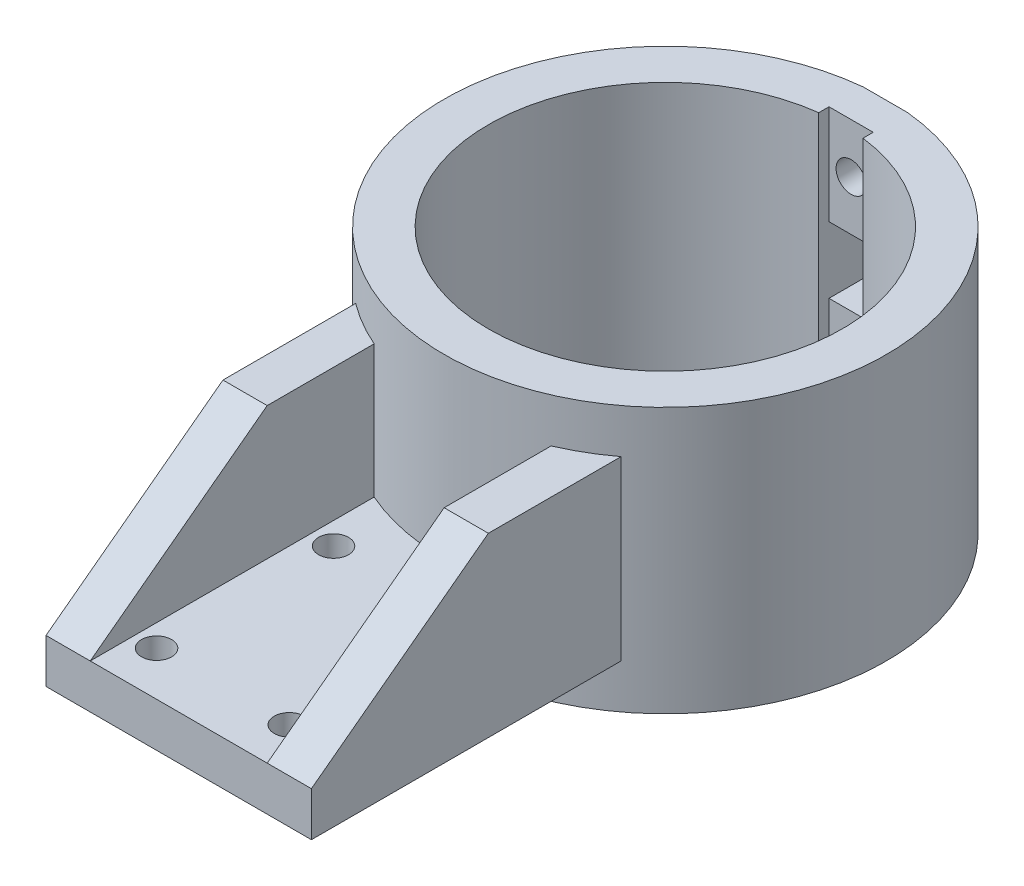
ISO-10303-21;
HEADER;
FILE_DESCRIPTION(('STEP AP214'),'2;1');
FILE_NAME('part.step','',(''),(''),'','','');
FILE_SCHEMA(('AUTOMOTIVE_DESIGN { 1 0 10303 214 1 1 1 1 }'));
ENDSEC;
DATA;
#1=APPLICATION_CONTEXT('core data for automotive mechanical design processes');
#2=APPLICATION_PROTOCOL_DEFINITION('international standard','automotive_design',2000,#1);
#3=PRODUCT_CONTEXT('',#1,'mechanical');
#4=PRODUCT('Part','Part','',(#3));
#5=PRODUCT_RELATED_PRODUCT_CATEGORY('part','',(#4));
#6=PRODUCT_DEFINITION_FORMATION('','',#4);
#7=PRODUCT_DEFINITION_CONTEXT('part definition',#1,'design');
#8=PRODUCT_DEFINITION('design','',#6,#7);
#9=PRODUCT_DEFINITION_SHAPE('','',#8);
#10=(LENGTH_UNIT() NAMED_UNIT(*) SI_UNIT(.MILLI.,.METRE.));
#11=(NAMED_UNIT(*) PLANE_ANGLE_UNIT() SI_UNIT($,.RADIAN.));
#12=(NAMED_UNIT(*) SI_UNIT($,.STERADIAN.) SOLID_ANGLE_UNIT());
#13=UNCERTAINTY_MEASURE_WITH_UNIT(LENGTH_MEASURE(1.E-05),#10,'distance_accuracy_value','');
#14=(GEOMETRIC_REPRESENTATION_CONTEXT(3) GLOBAL_UNCERTAINTY_ASSIGNED_CONTEXT((#13)) GLOBAL_UNIT_ASSIGNED_CONTEXT((#10,
#11,#12)) REPRESENTATION_CONTEXT('',''));
#15=CARTESIAN_POINT('',(0.,0.,0.));
#16=DIRECTION('',(0.,0.,1.));
#17=DIRECTION('',(1.,0.,0.));
#18=AXIS2_PLACEMENT_3D('',#15,#16,#17);
#19=CARTESIAN_POINT('',(-5.,0.,-42.));
#20=DIRECTION('',(0.,0.,-1.));
#21=DIRECTION('',(-1.,0.,0.));
#22=AXIS2_PLACEMENT_3D('',#19,#20,#21);
#23=PLANE('',#22);
#24=CARTESIAN_POINT('',(0.,11.25,-42.));
#25=DIRECTION('',(0.,0.,-1.));
#26=DIRECTION('',(-1.,0.,0.));
#27=AXIS2_PLACEMENT_3D('',#24,#25,#26);
#28=CIRCLE('',#27,3.39999999999999);
#29=CARTESIAN_POINT('',(-3.39999999999999,11.25,-42.));
#30=VERTEX_POINT('',#29);
#31=EDGE_CURVE('E326',#30,#30,#28,.T.);
#32=ORIENTED_EDGE('',*,*,#31,.T.);
#33=EDGE_LOOP('',(#32));
#34=FACE_BOUND('',#33,.T.);
#35=DIRECTION('',(0.,1.,0.));
#36=VECTOR('',#35,1.);
#37=CARTESIAN_POINT('',(5.,0.,-42.));
#38=LINE('',#37,#36);
#39=CARTESIAN_POINT('',(5.,0.,-42.));
#40=VERTEX_POINT('',#39);
#41=CARTESIAN_POINT('',(5.,22.5,-42.));
#42=VERTEX_POINT('',#41);
#43=EDGE_CURVE('E356',#40,#42,#38,.T.);
#44=ORIENTED_EDGE('',*,*,#43,.T.);
#45=DIRECTION('',(1.,0.,0.));
#46=VECTOR('',#45,1.);
#47=CARTESIAN_POINT('',(5.,22.5,-42.));
#48=LINE('',#47,#46);
#49=CARTESIAN_POINT('',(-5.,22.5,-42.));
#50=VERTEX_POINT('',#49);
#51=EDGE_CURVE('E55',#50,#42,#48,.T.);
#52=ORIENTED_EDGE('',*,*,#51,.F.);
#53=DIRECTION('',(0.,1.,0.));
#54=VECTOR('',#53,1.);
#55=CARTESIAN_POINT('',(-5.,0.,-42.));
#56=LINE('',#55,#54);
#57=CARTESIAN_POINT('',(-5.,0.,-42.));
#58=VERTEX_POINT('',#57);
#59=EDGE_CURVE('E216',#58,#50,#56,.T.);
#60=ORIENTED_EDGE('',*,*,#59,.F.);
#61=DIRECTION('',(-1.,0.,0.));
#62=VECTOR('',#61,1.);
#63=CARTESIAN_POINT('',(-5.,0.,-42.));
#64=LINE('',#63,#62);
#65=EDGE_CURVE('E342',#40,#58,#64,.T.);
#66=ORIENTED_EDGE('',*,*,#65,.F.);
#67=EDGE_LOOP('',(#44,#52,#60,#66));
#68=FACE_BOUND('',#67,.T.);
#69=ADVANCED_FACE('F38',(#34,#68),#23,.F.);
#70=CARTESIAN_POINT('',(5.,0.,-49.749371855331));
#71=DIRECTION('',(0.,0.,1.));
#72=DIRECTION('',(1.,0.,0.));
#73=AXIS2_PLACEMENT_3D('',#70,#71,#72);
#74=PLANE('',#73);
#75=CARTESIAN_POINT('',(0.,11.25,-49.749371855331));
#76=DIRECTION('',(0.,0.,-1.));
#77=DIRECTION('',(-1.,0.,0.));
#78=AXIS2_PLACEMENT_3D('',#75,#76,#77);
#79=CIRCLE('',#78,3.39999999999999);
#80=CARTESIAN_POINT('',(-3.4,11.25,-49.749371855331));
#81=VERTEX_POINT('',#80);
#82=EDGE_CURVE('E299',#81,#81,#79,.T.);
#83=ORIENTED_EDGE('',*,*,#82,.F.);
#84=EDGE_LOOP('',(#83));
#85=FACE_BOUND('',#84,.T.);
#86=DIRECTION('',(0.,1.,0.));
#87=VECTOR('',#86,1.);
#88=CARTESIAN_POINT('',(-5.,0.,-49.749371855331));
#89=LINE('',#88,#87);
#90=CARTESIAN_POINT('',(-5.,0.,-49.749371855331));
#91=VERTEX_POINT('',#90);
#92=CARTESIAN_POINT('',(-5.,22.5,-49.749371855331));
#93=VERTEX_POINT('',#92);
#94=EDGE_CURVE('E194',#91,#93,#89,.T.);
#95=ORIENTED_EDGE('',*,*,#94,.T.);
#96=DIRECTION('',(-1.,0.,0.));
#97=VECTOR('',#96,1.);
#98=CARTESIAN_POINT('',(5.,22.5,-49.749371855331));
#99=LINE('',#98,#97);
#100=CARTESIAN_POINT('',(5.,22.5,-49.749371855331));
#101=VERTEX_POINT('',#100);
#102=EDGE_CURVE('E172',#101,#93,#99,.T.);
#103=ORIENTED_EDGE('',*,*,#102,.F.);
#104=DIRECTION('',(0.,1.,0.));
#105=VECTOR('',#104,1.);
#106=CARTESIAN_POINT('',(5.,0.,-49.749371855331));
#107=LINE('',#106,#105);
#108=CARTESIAN_POINT('',(5.,0.,-49.749371855331));
#109=VERTEX_POINT('',#108);
#110=EDGE_CURVE('E191',#109,#101,#107,.T.);
#111=ORIENTED_EDGE('',*,*,#110,.F.);
#112=DIRECTION('',(1.,0.,0.));
#113=VECTOR('',#112,1.);
#114=CARTESIAN_POINT('',(5.,0.,-49.749371855331));
#115=LINE('',#114,#113);
#116=EDGE_CURVE('E357',#91,#109,#115,.T.);
#117=ORIENTED_EDGE('',*,*,#116,.F.);
#118=EDGE_LOOP('',(#95,#103,#111,#117));
#119=FACE_BOUND('',#118,.T.);
#120=ADVANCED_FACE('F190',(#85,#119),#74,.F.);
#121=CARTESIAN_POINT('',(0.,60.,0.));
#122=DIRECTION('',(0.,1.,0.));
#123=DIRECTION('',(0.,0.,1.));
#124=AXIS2_PLACEMENT_3D('',#121,#122,#123);
#125=PLANE('',#124);
#126=DIRECTION('',(0.,0.,-1.));
#127=VECTOR('',#126,1.);
#128=CARTESIAN_POINT('',(5.,60.,-42.));
#129=LINE('',#128,#127);
#130=CARTESIAN_POINT('',(5.,60.,-39.6862696659689));
#131=VERTEX_POINT('',#130);
#132=CARTESIAN_POINT('',(5.,60.,-42.));
#133=VERTEX_POINT('',#132);
#134=EDGE_CURVE('E201',#131,#133,#129,.T.);
#135=ORIENTED_EDGE('',*,*,#134,.F.);
#136=CARTESIAN_POINT('',(0.,60.,0.));
#137=DIRECTION('',(0.,1.,0.));
#138=DIRECTION('',(0.,0.,1.));
#139=AXIS2_PLACEMENT_3D('',#136,#137,#138);
#140=CIRCLE('',#139,40.);
#141=CARTESIAN_POINT('',(-5.,60.,-39.6862696659689));
#142=VERTEX_POINT('',#141);
#143=EDGE_CURVE('E283',#142,#131,#140,.T.);
#144=ORIENTED_EDGE('',*,*,#143,.F.);
#145=DIRECTION('',(0.,0.,1.));
#146=VECTOR('',#145,1.);
#147=CARTESIAN_POINT('',(-5.,60.,-42.));
#148=LINE('',#147,#146);
#149=CARTESIAN_POINT('',(-5.,60.,-42.));
#150=VERTEX_POINT('',#149);
#151=EDGE_CURVE('E343',#150,#142,#148,.T.);
#152=ORIENTED_EDGE('',*,*,#151,.F.);
#153=DIRECTION('',(-1.,0.,0.));
#154=VECTOR('',#153,1.);
#155=CARTESIAN_POINT('',(-5.,60.,-42.));
#156=LINE('',#155,#154);
#157=EDGE_CURVE('E205',#133,#150,#156,.T.);
#158=ORIENTED_EDGE('',*,*,#157,.F.);
#159=EDGE_LOOP('',(#135,#144,#152,#158));
#160=FACE_BOUND('',#159,.T.);
#161=DIRECTION('',(1.,0.,0.));
#162=VECTOR('',#161,1.);
#163=CARTESIAN_POINT('',(5.,60.,-49.749371855331));
#164=LINE('',#163,#162);
#165=CARTESIAN_POINT('',(-5.,60.,-49.749371855331));
#166=VERTEX_POINT('',#165);
#167=CARTESIAN_POINT('',(5.,60.,-49.749371855331));
#168=VERTEX_POINT('',#167);
#169=EDGE_CURVE('E209',#166,#168,#164,.T.);
#170=ORIENTED_EDGE('',*,*,#169,.F.);
#171=CARTESIAN_POINT('',(0.,60.,0.));
#172=DIRECTION('',(0.,1.,0.));
#173=DIRECTION('',(0.,0.,1.));
#174=AXIS2_PLACEMENT_3D('',#171,#172,#173);
#175=CIRCLE('',#174,50.);
#176=EDGE_CURVE('E288',#166,#168,#175,.T.);
#177=ORIENTED_EDGE('',*,*,#176,.T.);
#178=EDGE_LOOP('',(#170,#177));
#179=FACE_BOUND('',#178,.T.);
#180=ADVANCED_FACE('F365',(#160,#179),#125,.T.);
#181=CARTESIAN_POINT('',(0.,0.,0.));
#182=DIRECTION('',(0.,1.,0.));
#183=DIRECTION('',(0.,0.,1.));
#184=AXIS2_PLACEMENT_3D('',#181,#182,#183);
#185=PLANE('',#184);
#186=CARTESIAN_POINT('',(0.,0.,0.));
#187=DIRECTION('',(0.,1.,0.));
#188=DIRECTION('',(0.,0.,1.));
#189=AXIS2_PLACEMENT_3D('',#186,#187,#188);
#190=CIRCLE('',#189,40.);
#191=CARTESIAN_POINT('',(-5.,0.,-39.6862696659689));
#192=VERTEX_POINT('',#191);
#193=CARTESIAN_POINT('',(5.,0.,-39.6862696659689));
#194=VERTEX_POINT('',#193);
#195=EDGE_CURVE('E269',#192,#194,#190,.T.);
#196=ORIENTED_EDGE('',*,*,#195,.T.);
#197=DIRECTION('',(0.,0.,-1.));
#198=VECTOR('',#197,1.);
#199=CARTESIAN_POINT('',(5.,0.,-42.));
#200=LINE('',#199,#198);
#201=EDGE_CURVE('E339',#194,#40,#200,.T.);
#202=ORIENTED_EDGE('',*,*,#201,.T.);
#203=ORIENTED_EDGE('',*,*,#65,.T.);
#204=DIRECTION('',(0.,0.,1.));
#205=VECTOR('',#204,1.);
#206=CARTESIAN_POINT('',(-5.,0.,-42.));
#207=LINE('',#206,#205);
#208=EDGE_CURVE('E346',#58,#192,#207,.T.);
#209=ORIENTED_EDGE('',*,*,#208,.T.);
#210=EDGE_LOOP('',(#196,#202,#203,#209));
#211=FACE_BOUND('',#210,.T.);
#212=CARTESIAN_POINT('',(0.,0.,0.));
#213=DIRECTION('',(0.,1.,0.));
#214=DIRECTION('',(0.,0.,1.));
#215=AXIS2_PLACEMENT_3D('',#212,#213,#214);
#216=CIRCLE('',#215,50.);
#217=EDGE_CURVE('E200',#91,#109,#216,.T.);
#218=ORIENTED_EDGE('',*,*,#217,.F.);
#219=ORIENTED_EDGE('',*,*,#116,.T.);
#220=EDGE_LOOP('',(#218,#219));
#221=FACE_BOUND('',#220,.T.);
#222=ADVANCED_FACE('F379',(#211,#221),#185,.F.);
#223=CARTESIAN_POINT('',(0.,60.,0.));
#224=DIRECTION('',(0.,-1.,0.));
#225=DIRECTION('',(0.,0.,-1.));
#226=AXIS2_PLACEMENT_3D('',#223,#224,#225);
#227=CYLINDRICAL_SURFACE('',#226,50.);
#228=DIRECTION('',(0.,-1.,0.));
#229=VECTOR('',#228,1.);
#230=CARTESIAN_POINT('',(-20.,60.,45.8257569495584));
#231=LINE('',#230,#229);
#232=CARTESIAN_POINT('',(-20.,20.,45.8257569495584));
#233=VERTEX_POINT('',#232);
#234=CARTESIAN_POINT('',(-20.,50.,45.8257569495584));
#235=VERTEX_POINT('',#234);
#236=EDGE_CURVE('E237',#233,#235,#231,.F.);
#237=ORIENTED_EDGE('',*,*,#236,.F.);
#238=CARTESIAN_POINT('',(0.,20.,0.));
#239=DIRECTION('',(0.,1.,0.));
#240=DIRECTION('',(0.,0.,1.));
#241=AXIS2_PLACEMENT_3D('',#238,#239,#240);
#242=CIRCLE('',#241,50.);
#243=CARTESIAN_POINT('',(20.,20.,45.8257569495584));
#244=VERTEX_POINT('',#243);
#245=EDGE_CURVE('E265',#244,#233,#242,.F.);
#246=ORIENTED_EDGE('',*,*,#245,.F.);
#247=DIRECTION('',(0.,-1.,0.));
#248=VECTOR('',#247,1.);
#249=CARTESIAN_POINT('',(20.,60.,45.8257569495584));
#250=LINE('',#249,#248);
#251=CARTESIAN_POINT('',(20.,50.,45.8257569495584));
#252=VERTEX_POINT('',#251);
#253=EDGE_CURVE('E262',#252,#244,#250,.T.);
#254=ORIENTED_EDGE('',*,*,#253,.F.);
#255=CARTESIAN_POINT('',(0.,50.,0.));
#256=DIRECTION('',(0.,1.,0.));
#257=DIRECTION('',(-1.,0.,0.));
#258=AXIS2_PLACEMENT_3D('',#255,#256,#257);
#259=CIRCLE('',#258,50.);
#260=CARTESIAN_POINT('',(30.,50.,40.));
#261=VERTEX_POINT('',#260);
#262=EDGE_CURVE('E261',#261,#252,#259,.F.);
#263=ORIENTED_EDGE('',*,*,#262,.F.);
#264=DIRECTION('',(0.,-1.,0.));
#265=VECTOR('',#264,1.);
#266=CARTESIAN_POINT('',(30.,60.,40.));
#267=LINE('',#266,#265);
#268=CARTESIAN_POINT('',(30.,10.,40.));
#269=VERTEX_POINT('',#268);
#270=EDGE_CURVE('E258',#269,#261,#267,.F.);
#271=ORIENTED_EDGE('',*,*,#270,.F.);
#272=CARTESIAN_POINT('',(0.,10.,0.));
#273=DIRECTION('',(0.,-1.,0.));
#274=DIRECTION('',(1.,0.,0.));
#275=AXIS2_PLACEMENT_3D('',#272,#273,#274);
#276=CIRCLE('',#275,50.);
#277=CARTESIAN_POINT('',(-30.,10.,40.));
#278=VERTEX_POINT('',#277);
#279=EDGE_CURVE('E255',#278,#269,#276,.F.);
#280=ORIENTED_EDGE('',*,*,#279,.F.);
#281=DIRECTION('',(0.,-1.,0.));
#282=VECTOR('',#281,1.);
#283=CARTESIAN_POINT('',(-30.,60.,40.));
#284=LINE('',#283,#282);
#285=CARTESIAN_POINT('',(-30.,50.,40.));
#286=VERTEX_POINT('',#285);
#287=EDGE_CURVE('E236',#286,#278,#284,.T.);
#288=ORIENTED_EDGE('',*,*,#287,.F.);
#289=CARTESIAN_POINT('',(0.,50.,0.));
#290=DIRECTION('',(0.,1.,0.));
#291=DIRECTION('',(0.,0.,1.));
#292=AXIS2_PLACEMENT_3D('',#289,#290,#291);
#293=CIRCLE('',#292,50.);
#294=EDGE_CURVE('E245',#235,#286,#293,.F.);
#295=ORIENTED_EDGE('',*,*,#294,.F.);
#296=EDGE_LOOP('',(#237,#246,#254,#263,#271,#280,#288,#295));
#297=FACE_BOUND('',#296,.T.);
#298=ORIENTED_EDGE('',*,*,#176,.F.);
#299=CARTESIAN_POINT('',(-5.,37.5,-49.749371855331));
#300=VERTEX_POINT('',#299);
#301=EDGE_CURVE('E212',#300,#166,#89,.T.);
#302=ORIENTED_EDGE('',*,*,#301,.F.);
#303=DIRECTION('',(0.,1.,0.));
#304=VECTOR('',#303,1.);
#305=CARTESIAN_POINT('',(-5.,37.5,-49.749371855331));
#306=LINE('',#305,#304);
#307=EDGE_CURVE('E195',#93,#300,#306,.T.);
#308=ORIENTED_EDGE('',*,*,#307,.F.);
#309=ORIENTED_EDGE('',*,*,#94,.F.);
#310=ORIENTED_EDGE('',*,*,#217,.T.);
#311=ORIENTED_EDGE('',*,*,#110,.T.);
#312=DIRECTION('',(0.,-1.,0.));
#313=VECTOR('',#312,1.);
#314=CARTESIAN_POINT('',(5.,37.5,-49.749371855331));
#315=LINE('',#314,#313);
#316=CARTESIAN_POINT('',(5.,37.5,-49.749371855331));
#317=VERTEX_POINT('',#316);
#318=EDGE_CURVE('E179',#317,#101,#315,.T.);
#319=ORIENTED_EDGE('',*,*,#318,.F.);
#320=EDGE_CURVE('E202',#317,#168,#107,.T.);
#321=ORIENTED_EDGE('',*,*,#320,.T.);
#322=EDGE_LOOP('',(#298,#302,#308,#309,#310,#311,#319,#321));
#323=FACE_BOUND('',#322,.T.);
#324=ADVANCED_FACE('F40',(#297,#323),#227,.T.);
#325=CARTESIAN_POINT('',(0.,60.,0.));
#326=DIRECTION('',(0.,-1.,0.));
#327=DIRECTION('',(0.,0.,-1.));
#328=AXIS2_PLACEMENT_3D('',#325,#326,#327);
#329=CYLINDRICAL_SURFACE('',#328,40.);
#330=DIRECTION('',(0.,-1.,0.));
#331=VECTOR('',#330,1.);
#332=CARTESIAN_POINT('',(5.,60.,-39.6862696659689));
#333=LINE('',#332,#331);
#334=EDGE_CURVE('E11',#194,#131,#333,.F.);
#335=ORIENTED_EDGE('',*,*,#334,.F.);
#336=ORIENTED_EDGE('',*,*,#195,.F.);
#337=DIRECTION('',(0.,-1.,0.));
#338=VECTOR('',#337,1.);
#339=CARTESIAN_POINT('',(-5.,60.,-39.6862696659689));
#340=LINE('',#339,#338);
#341=EDGE_CURVE('E47',#142,#192,#340,.T.);
#342=ORIENTED_EDGE('',*,*,#341,.F.);
#343=ORIENTED_EDGE('',*,*,#143,.T.);
#344=EDGE_LOOP('',(#335,#336,#342,#343));
#345=FACE_BOUND('',#344,.T.);
#346=ADVANCED_FACE('F376',(#345),#329,.F.);
#347=CARTESIAN_POINT('',(-20.,20.,-50.002));
#348=DIRECTION('',(0.,1.,0.));
#349=DIRECTION('',(0.,0.,1.));
#350=AXIS2_PLACEMENT_3D('',#347,#348,#349);
#351=PLANE('',#350);
#352=CARTESIAN_POINT('',(-15.,20.,60.));
#353=DIRECTION('',(0.,1.,0.));
#354=DIRECTION('',(0.,0.,1.));
#355=AXIS2_PLACEMENT_3D('',#352,#353,#354);
#356=CIRCLE('',#355,3.39999999999999);
#357=CARTESIAN_POINT('',(-15.,20.,63.4));
#358=VERTEX_POINT('',#357);
#359=EDGE_CURVE('E445',#358,#358,#356,.T.);
#360=ORIENTED_EDGE('',*,*,#359,.F.);
#361=EDGE_LOOP('',(#360));
#362=FACE_BOUND('',#361,.T.);
#363=CARTESIAN_POINT('',(15.,20.,60.));
#364=DIRECTION('',(0.,1.,0.));
#365=DIRECTION('',(0.,0.,1.));
#366=AXIS2_PLACEMENT_3D('',#363,#364,#365);
#367=CIRCLE('',#366,3.39999999999999);
#368=CARTESIAN_POINT('',(15.,20.,63.4));
#369=VERTEX_POINT('',#368);
#370=EDGE_CURVE('E316',#369,#369,#367,.T.);
#371=ORIENTED_EDGE('',*,*,#370,.F.);
#372=EDGE_LOOP('',(#371));
#373=FACE_BOUND('',#372,.T.);
#374=CARTESIAN_POINT('',(-15.,20.,100.));
#375=DIRECTION('',(0.,1.,0.));
#376=DIRECTION('',(0.,0.,1.));
#377=AXIS2_PLACEMENT_3D('',#374,#375,#376);
#378=CIRCLE('',#377,3.39999999999999);
#379=CARTESIAN_POINT('',(-15.,20.,103.4));
#380=VERTEX_POINT('',#379);
#381=EDGE_CURVE('E304',#380,#380,#378,.T.);
#382=ORIENTED_EDGE('',*,*,#381,.F.);
#383=EDGE_LOOP('',(#382));
#384=FACE_BOUND('',#383,.T.);
#385=CARTESIAN_POINT('',(15.,20.,100.));
#386=DIRECTION('',(0.,1.,0.));
#387=DIRECTION('',(0.,0.,1.));
#388=AXIS2_PLACEMENT_3D('',#385,#386,#387);
#389=CIRCLE('',#388,3.39999999999999);
#390=CARTESIAN_POINT('',(15.,20.,103.4));
#391=VERTEX_POINT('',#390);
#392=EDGE_CURVE('E303',#391,#391,#389,.T.);
#393=ORIENTED_EDGE('',*,*,#392,.F.);
#394=EDGE_LOOP('',(#393));
#395=FACE_BOUND('',#394,.T.);
#396=DIRECTION('',(0.,0.,1.));
#397=VECTOR('',#396,1.);
#398=CARTESIAN_POINT('',(20.,20.,-50.002));
#399=LINE('',#398,#397);
#400=CARTESIAN_POINT('',(20.,20.,110.));
#401=VERTEX_POINT('',#400);
#402=EDGE_CURVE('E266',#244,#401,#399,.T.);
#403=ORIENTED_EDGE('',*,*,#402,.F.);
#404=ORIENTED_EDGE('',*,*,#245,.T.);
#405=DIRECTION('',(0.,0.,1.));
#406=VECTOR('',#405,1.);
#407=CARTESIAN_POINT('',(-20.,20.,-50.002));
#408=LINE('',#407,#406);
#409=CARTESIAN_POINT('',(-20.,20.,110.));
#410=VERTEX_POINT('',#409);
#411=EDGE_CURVE('E252',#233,#410,#408,.T.);
#412=ORIENTED_EDGE('',*,*,#411,.T.);
#413=DIRECTION('',(-1.,0.,0.));
#414=VECTOR('',#413,1.);
#415=CARTESIAN_POINT('',(20.,20.,110.));
#416=LINE('',#415,#414);
#417=EDGE_CURVE('E225',#401,#410,#416,.T.);
#418=ORIENTED_EDGE('',*,*,#417,.F.);
#419=EDGE_LOOP('',(#403,#404,#412,#418));
#420=FACE_BOUND('',#419,.T.);
#421=ADVANCED_FACE('F452',(#362,#373,#384,#395,#420),#351,.T.);
#422=CARTESIAN_POINT('',(20.,20.,-50.002));
#423=DIRECTION('',(-1.,0.,0.));
#424=DIRECTION('',(0.,0.,1.));
#425=AXIS2_PLACEMENT_3D('',#422,#423,#424);
#426=PLANE('',#425);
#427=DIRECTION('',(0.,-0.6,0.8));
#428=VECTOR('',#427,1.);
#429=CARTESIAN_POINT('',(20.,96.80096,7.59872000000002));
#430=LINE('',#429,#428);
#431=CARTESIAN_POINT('',(20.,50.,70.));
#432=VERTEX_POINT('',#431);
#433=EDGE_CURVE('E223',#432,#401,#430,.T.);
#434=ORIENTED_EDGE('',*,*,#433,.F.);
#435=DIRECTION('',(0.,0.,1.));
#436=VECTOR('',#435,1.);
#437=CARTESIAN_POINT('',(20.,50.,-50.002));
#438=LINE('',#437,#436);
#439=EDGE_CURVE('E270',#252,#432,#438,.T.);
#440=ORIENTED_EDGE('',*,*,#439,.F.);
#441=ORIENTED_EDGE('',*,*,#253,.T.);
#442=ORIENTED_EDGE('',*,*,#402,.T.);
#443=EDGE_LOOP('',(#434,#440,#441,#442));
#444=FACE_BOUND('',#443,.T.);
#445=ADVANCED_FACE('F455',(#444),#426,.T.);
#446=CARTESIAN_POINT('',(20.,50.,-50.002));
#447=DIRECTION('',(0.,1.,0.));
#448=DIRECTION('',(-1.,0.,0.));
#449=AXIS2_PLACEMENT_3D('',#446,#447,#448);
#450=PLANE('',#449);
#451=DIRECTION('',(-1.,0.,0.));
#452=VECTOR('',#451,1.);
#453=CARTESIAN_POINT('',(50.,50.,70.));
#454=LINE('',#453,#452);
#455=CARTESIAN_POINT('',(30.,50.,70.));
#456=VERTEX_POINT('',#455);
#457=EDGE_CURVE('E215',#456,#432,#454,.T.);
#458=ORIENTED_EDGE('',*,*,#457,.F.);
#459=DIRECTION('',(0.,0.,1.));
#460=VECTOR('',#459,1.);
#461=CARTESIAN_POINT('',(30.,50.,-50.002));
#462=LINE('',#461,#460);
#463=EDGE_CURVE('E273',#261,#456,#462,.T.);
#464=ORIENTED_EDGE('',*,*,#463,.F.);
#465=ORIENTED_EDGE('',*,*,#262,.T.);
#466=ORIENTED_EDGE('',*,*,#439,.T.);
#467=EDGE_LOOP('',(#458,#464,#465,#466));
#468=FACE_BOUND('',#467,.T.);
#469=ADVANCED_FACE('F471',(#468),#450,.T.);
#470=CARTESIAN_POINT('',(30.,10.,-50.002));
#471=DIRECTION('',(1.,0.,0.));
#472=DIRECTION('',(0.,0.,-1.));
#473=AXIS2_PLACEMENT_3D('',#470,#471,#472);
#474=PLANE('',#473);
#475=DIRECTION('',(0.,0.6,-0.8));
#476=VECTOR('',#475,1.);
#477=CARTESIAN_POINT('',(30.,93.20096,12.39872));
#478=LINE('',#477,#476);
#479=CARTESIAN_POINT('',(30.,20.,110.));
#480=VERTEX_POINT('',#479);
#481=EDGE_CURVE('E221',#480,#456,#478,.T.);
#482=ORIENTED_EDGE('',*,*,#481,.F.);
#483=DIRECTION('',(0.,1.,0.));
#484=VECTOR('',#483,1.);
#485=CARTESIAN_POINT('',(30.,10.,110.));
#486=LINE('',#485,#484);
#487=CARTESIAN_POINT('',(30.,10.,110.));
#488=VERTEX_POINT('',#487);
#489=EDGE_CURVE('E233',#488,#480,#486,.T.);
#490=ORIENTED_EDGE('',*,*,#489,.F.);
#491=DIRECTION('',(0.,0.,1.));
#492=VECTOR('',#491,1.);
#493=CARTESIAN_POINT('',(30.,10.,-50.002));
#494=LINE('',#493,#492);
#495=EDGE_CURVE('E276',#269,#488,#494,.T.);
#496=ORIENTED_EDGE('',*,*,#495,.F.);
#497=ORIENTED_EDGE('',*,*,#270,.T.);
#498=ORIENTED_EDGE('',*,*,#463,.T.);
#499=EDGE_LOOP('',(#482,#490,#496,#497,#498));
#500=FACE_BOUND('',#499,.T.);
#501=ADVANCED_FACE('F474',(#500),#474,.T.);
#502=CARTESIAN_POINT('',(30.,10.,-50.002));
#503=DIRECTION('',(0.,-1.,0.));
#504=DIRECTION('',(1.,0.,0.));
#505=AXIS2_PLACEMENT_3D('',#502,#503,#504);
#506=PLANE('',#505);
#507=CARTESIAN_POINT('',(-15.,10.,60.));
#508=DIRECTION('',(0.,-1.,0.));
#509=DIRECTION('',(1.,0.,0.));
#510=AXIS2_PLACEMENT_3D('',#507,#508,#509);
#511=CIRCLE('',#510,3.39999999999999);
#512=CARTESIAN_POINT('',(-11.6,10.,60.));
#513=VERTEX_POINT('',#512);
#514=EDGE_CURVE('E42',#513,#513,#511,.T.);
#515=ORIENTED_EDGE('',*,*,#514,.F.);
#516=EDGE_LOOP('',(#515));
#517=FACE_BOUND('',#516,.T.);
#518=CARTESIAN_POINT('',(15.,10.,60.));
#519=DIRECTION('',(0.,-1.,0.));
#520=DIRECTION('',(1.,0.,0.));
#521=AXIS2_PLACEMENT_3D('',#518,#519,#520);
#522=CIRCLE('',#521,3.39999999999999);
#523=CARTESIAN_POINT('',(18.4,10.,60.));
#524=VERTEX_POINT('',#523);
#525=EDGE_CURVE('E311',#524,#524,#522,.T.);
#526=ORIENTED_EDGE('',*,*,#525,.F.);
#527=EDGE_LOOP('',(#526));
#528=FACE_BOUND('',#527,.T.);
#529=CARTESIAN_POINT('',(-15.,10.,100.));
#530=DIRECTION('',(0.,-1.,0.));
#531=DIRECTION('',(1.,0.,0.));
#532=AXIS2_PLACEMENT_3D('',#529,#530,#531);
#533=CIRCLE('',#532,3.39999999999999);
#534=CARTESIAN_POINT('',(-11.6,10.,100.));
#535=VERTEX_POINT('',#534);
#536=EDGE_CURVE('E301',#535,#535,#533,.T.);
#537=ORIENTED_EDGE('',*,*,#536,.F.);
#538=EDGE_LOOP('',(#537));
#539=FACE_BOUND('',#538,.T.);
#540=CARTESIAN_POINT('',(15.,10.,100.));
#541=DIRECTION('',(0.,-1.,0.));
#542=DIRECTION('',(1.,0.,0.));
#543=AXIS2_PLACEMENT_3D('',#540,#541,#542);
#544=CIRCLE('',#543,3.39999999999999);
#545=CARTESIAN_POINT('',(18.4,10.,100.));
#546=VERTEX_POINT('',#545);
#547=EDGE_CURVE('E308',#546,#546,#544,.T.);
#548=ORIENTED_EDGE('',*,*,#547,.F.);
#549=EDGE_LOOP('',(#548));
#550=FACE_BOUND('',#549,.T.);
#551=ORIENTED_EDGE('',*,*,#495,.T.);
#552=DIRECTION('',(1.,0.,0.));
#553=VECTOR('',#552,1.);
#554=CARTESIAN_POINT('',(-30.,9.99999999999999,110.));
#555=LINE('',#554,#553);
#556=CARTESIAN_POINT('',(-30.,9.99999999999999,110.));
#557=VERTEX_POINT('',#556);
#558=EDGE_CURVE('E230',#557,#488,#555,.T.);
#559=ORIENTED_EDGE('',*,*,#558,.F.);
#560=DIRECTION('',(0.,0.,1.));
#561=VECTOR('',#560,1.);
#562=CARTESIAN_POINT('',(-30.,9.99999999999999,-50.002));
#563=LINE('',#562,#561);
#564=EDGE_CURVE('E244',#278,#557,#563,.T.);
#565=ORIENTED_EDGE('',*,*,#564,.F.);
#566=ORIENTED_EDGE('',*,*,#279,.T.);
#567=EDGE_LOOP('',(#551,#559,#565,#566));
#568=FACE_BOUND('',#567,.T.);
#569=ADVANCED_FACE('F479',(#517,#528,#539,#550,#568),#506,.T.);
#570=CARTESIAN_POINT('',(-30.,9.99999999999999,-50.002));
#571=DIRECTION('',(-1.,0.,0.));
#572=DIRECTION('',(0.,0.,1.));
#573=AXIS2_PLACEMENT_3D('',#570,#571,#572);
#574=PLANE('',#573);
#575=DIRECTION('',(0.,-0.6,0.8));
#576=VECTOR('',#575,1.);
#577=CARTESIAN_POINT('',(-30.,93.20096,12.39872));
#578=LINE('',#577,#576);
#579=CARTESIAN_POINT('',(-30.,50.,70.));
#580=VERTEX_POINT('',#579);
#581=CARTESIAN_POINT('',(-30.,20.,110.));
#582=VERTEX_POINT('',#581);
#583=EDGE_CURVE('E219',#580,#582,#578,.T.);
#584=ORIENTED_EDGE('',*,*,#583,.F.);
#585=DIRECTION('',(0.,0.,1.));
#586=VECTOR('',#585,1.);
#587=CARTESIAN_POINT('',(-30.,50.,-50.002));
#588=LINE('',#587,#586);
#589=EDGE_CURVE('E241',#286,#580,#588,.T.);
#590=ORIENTED_EDGE('',*,*,#589,.F.);
#591=ORIENTED_EDGE('',*,*,#287,.T.);
#592=ORIENTED_EDGE('',*,*,#564,.T.);
#593=DIRECTION('',(0.,-1.,0.));
#594=VECTOR('',#593,1.);
#595=CARTESIAN_POINT('',(-30.,50.,110.));
#596=LINE('',#595,#594);
#597=EDGE_CURVE('E228',#582,#557,#596,.T.);
#598=ORIENTED_EDGE('',*,*,#597,.F.);
#599=EDGE_LOOP('',(#584,#590,#591,#592,#598));
#600=FACE_BOUND('',#599,.T.);
#601=ADVANCED_FACE('F484',(#600),#574,.T.);
#602=CARTESIAN_POINT('',(-30.,50.,-50.002));
#603=DIRECTION('',(0.,1.,0.));
#604=DIRECTION('',(0.,0.,1.));
#605=AXIS2_PLACEMENT_3D('',#602,#603,#604);
#606=PLANE('',#605);
#607=CARTESIAN_POINT('',(-20.,50.,70.));
#608=VERTEX_POINT('',#607);
#609=EDGE_CURVE('E213',#608,#580,#454,.T.);
#610=ORIENTED_EDGE('',*,*,#609,.F.);
#611=DIRECTION('',(0.,0.,1.));
#612=VECTOR('',#611,1.);
#613=CARTESIAN_POINT('',(-20.,50.,-50.002));
#614=LINE('',#613,#612);
#615=EDGE_CURVE('E240',#235,#608,#614,.T.);
#616=ORIENTED_EDGE('',*,*,#615,.F.);
#617=ORIENTED_EDGE('',*,*,#294,.T.);
#618=ORIENTED_EDGE('',*,*,#589,.T.);
#619=EDGE_LOOP('',(#610,#616,#617,#618));
#620=FACE_BOUND('',#619,.T.);
#621=ADVANCED_FACE('F489',(#620),#606,.T.);
#622=CARTESIAN_POINT('',(-20.,50.,-50.002));
#623=DIRECTION('',(1.,0.,0.));
#624=DIRECTION('',(0.,1.,0.));
#625=AXIS2_PLACEMENT_3D('',#622,#623,#624);
#626=PLANE('',#625);
#627=DIRECTION('',(0.,0.6,-0.8));
#628=VECTOR('',#627,1.);
#629=CARTESIAN_POINT('',(-20.,107.60096,-6.80127999999998));
#630=LINE('',#629,#628);
#631=EDGE_CURVE('E217',#410,#608,#630,.T.);
#632=ORIENTED_EDGE('',*,*,#631,.F.);
#633=ORIENTED_EDGE('',*,*,#411,.F.);
#634=ORIENTED_EDGE('',*,*,#236,.T.);
#635=ORIENTED_EDGE('',*,*,#615,.T.);
#636=EDGE_LOOP('',(#632,#633,#634,#635));
#637=FACE_BOUND('',#636,.T.);
#638=ADVANCED_FACE('F457',(#637),#626,.T.);
#639=CARTESIAN_POINT('',(0.,0.,110.));
#640=DIRECTION('',(0.,0.,-1.));
#641=DIRECTION('',(-1.,0.,0.));
#642=AXIS2_PLACEMENT_3D('',#639,#640,#641);
#643=PLANE('',#642);
#644=ORIENTED_EDGE('',*,*,#489,.T.);
#645=DIRECTION('',(-1.,0.,0.));
#646=VECTOR('',#645,1.);
#647=CARTESIAN_POINT('',(0.,20.,110.));
#648=LINE('',#647,#646);
#649=EDGE_CURVE('E295',#480,#401,#648,.T.);
#650=ORIENTED_EDGE('',*,*,#649,.T.);
#651=ORIENTED_EDGE('',*,*,#417,.T.);
#652=EDGE_CURVE('E291',#410,#582,#648,.T.);
#653=ORIENTED_EDGE('',*,*,#652,.T.);
#654=ORIENTED_EDGE('',*,*,#597,.T.);
#655=ORIENTED_EDGE('',*,*,#558,.T.);
#656=EDGE_LOOP('',(#644,#650,#651,#653,#654,#655));
#657=FACE_BOUND('',#656,.T.);
#658=ADVANCED_FACE('F495',(#657),#643,.F.);
#659=CARTESIAN_POINT('',(50.,20.,110.));
#660=DIRECTION('',(0.,-0.8,-0.6));
#661=DIRECTION('',(0.,0.6,-0.8));
#662=AXIS2_PLACEMENT_3D('',#659,#660,#661);
#663=PLANE('',#662);
#664=ORIENTED_EDGE('',*,*,#583,.T.);
#665=ORIENTED_EDGE('',*,*,#652,.F.);
#666=ORIENTED_EDGE('',*,*,#631,.T.);
#667=ORIENTED_EDGE('',*,*,#609,.T.);
#668=EDGE_LOOP('',(#664,#665,#666,#667));
#669=FACE_BOUND('',#668,.T.);
#670=ADVANCED_FACE('F499',(#669),#663,.F.);
#671=ORIENTED_EDGE('',*,*,#433,.T.);
#672=ORIENTED_EDGE('',*,*,#649,.F.);
#673=ORIENTED_EDGE('',*,*,#481,.T.);
#674=ORIENTED_EDGE('',*,*,#457,.T.);
#675=EDGE_LOOP('',(#671,#672,#673,#674));
#676=FACE_BOUND('',#675,.T.);
#677=ADVANCED_FACE('F497',(#676),#663,.F.);
#678=CARTESIAN_POINT('',(5.,0.,-42.));
#679=DIRECTION('',(1.,0.,0.));
#680=DIRECTION('',(0.,0.,-1.));
#681=AXIS2_PLACEMENT_3D('',#678,#679,#680);
#682=PLANE('',#681);
#683=ORIENTED_EDGE('',*,*,#334,.T.);
#684=ORIENTED_EDGE('',*,*,#134,.T.);
#685=CARTESIAN_POINT('',(5.,37.5,-42.));
#686=VERTEX_POINT('',#685);
#687=EDGE_CURVE('E348',#686,#133,#38,.T.);
#688=ORIENTED_EDGE('',*,*,#687,.F.);
#689=DIRECTION('',(0.,0.,-1.));
#690=VECTOR('',#689,1.);
#691=CARTESIAN_POINT('',(5.,37.5,110.001));
#692=LINE('',#691,#690);
#693=EDGE_CURVE('E182',#686,#317,#692,.T.);
#694=ORIENTED_EDGE('',*,*,#693,.T.);
#695=ORIENTED_EDGE('',*,*,#318,.T.);
#696=DIRECTION('',(0.,0.,-1.));
#697=VECTOR('',#696,1.);
#698=CARTESIAN_POINT('',(5.,22.5,110.001));
#699=LINE('',#698,#697);
#700=EDGE_CURVE('E168',#42,#101,#699,.T.);
#701=ORIENTED_EDGE('',*,*,#700,.F.);
#702=ORIENTED_EDGE('',*,*,#43,.F.);
#703=ORIENTED_EDGE('',*,*,#201,.F.);
#704=EDGE_LOOP('',(#683,#684,#688,#694,#695,#701,#702,#703));
#705=FACE_BOUND('',#704,.T.);
#706=ADVANCED_FACE('F180',(#705),#682,.F.);
#707=CARTESIAN_POINT('',(-5.,0.,-42.));
#708=DIRECTION('',(-1.,0.,0.));
#709=DIRECTION('',(0.,0.,1.));
#710=AXIS2_PLACEMENT_3D('',#707,#708,#709);
#711=PLANE('',#710);
#712=ORIENTED_EDGE('',*,*,#341,.T.);
#713=ORIENTED_EDGE('',*,*,#208,.F.);
#714=ORIENTED_EDGE('',*,*,#59,.T.);
#715=DIRECTION('',(0.,0.,-1.));
#716=VECTOR('',#715,1.);
#717=CARTESIAN_POINT('',(-5.,22.5,110.001));
#718=LINE('',#717,#716);
#719=EDGE_CURVE('E176',#50,#93,#718,.T.);
#720=ORIENTED_EDGE('',*,*,#719,.T.);
#721=ORIENTED_EDGE('',*,*,#307,.T.);
#722=DIRECTION('',(0.,0.,-1.));
#723=VECTOR('',#722,1.);
#724=CARTESIAN_POINT('',(-5.,37.5,110.001));
#725=LINE('',#724,#723);
#726=CARTESIAN_POINT('',(-5.,37.5,-42.));
#727=VERTEX_POINT('',#726);
#728=EDGE_CURVE('E335',#727,#300,#725,.T.);
#729=ORIENTED_EDGE('',*,*,#728,.F.);
#730=EDGE_CURVE('E355',#727,#150,#56,.T.);
#731=ORIENTED_EDGE('',*,*,#730,.T.);
#732=ORIENTED_EDGE('',*,*,#151,.T.);
#733=EDGE_LOOP('',(#712,#713,#714,#720,#721,#729,#731,#732));
#734=FACE_BOUND('',#733,.T.);
#735=ADVANCED_FACE('F367',(#734),#711,.F.);
#736=CARTESIAN_POINT('',(0.,48.75,-42.));
#737=DIRECTION('',(0.,0.,-1.));
#738=DIRECTION('',(-1.,0.,0.));
#739=AXIS2_PLACEMENT_3D('',#736,#737,#738);
#740=CIRCLE('',#739,3.39999999999999);
#741=CARTESIAN_POINT('',(-3.39999999999999,48.75,-42.));
#742=VERTEX_POINT('',#741);
#743=EDGE_CURVE('E297',#742,#742,#740,.T.);
#744=ORIENTED_EDGE('',*,*,#743,.T.);
#745=EDGE_LOOP('',(#744));
#746=FACE_BOUND('',#745,.T.);
#747=ORIENTED_EDGE('',*,*,#730,.F.);
#748=DIRECTION('',(-1.,0.,0.));
#749=VECTOR('',#748,1.);
#750=CARTESIAN_POINT('',(5.,37.5,-42.));
#751=LINE('',#750,#749);
#752=EDGE_CURVE('E186',#686,#727,#751,.T.);
#753=ORIENTED_EDGE('',*,*,#752,.F.);
#754=ORIENTED_EDGE('',*,*,#687,.T.);
#755=ORIENTED_EDGE('',*,*,#157,.T.);
#756=EDGE_LOOP('',(#747,#753,#754,#755));
#757=FACE_BOUND('',#756,.T.);
#758=ADVANCED_FACE('F386',(#746,#757),#23,.F.);
#759=CARTESIAN_POINT('',(0.,48.75,-49.749371855331));
#760=DIRECTION('',(0.,0.,-1.));
#761=DIRECTION('',(-1.,0.,0.));
#762=AXIS2_PLACEMENT_3D('',#759,#760,#761);
#763=CIRCLE('',#762,3.39999999999999);
#764=CARTESIAN_POINT('',(-3.39999999999999,48.75,-49.749371855331));
#765=VERTEX_POINT('',#764);
#766=EDGE_CURVE('E300',#765,#765,#763,.T.);
#767=ORIENTED_EDGE('',*,*,#766,.F.);
#768=EDGE_LOOP('',(#767));
#769=FACE_BOUND('',#768,.T.);
#770=ORIENTED_EDGE('',*,*,#320,.F.);
#771=DIRECTION('',(1.,0.,0.));
#772=VECTOR('',#771,1.);
#773=CARTESIAN_POINT('',(5.,37.5,-49.749371855331));
#774=LINE('',#773,#772);
#775=EDGE_CURVE('E63',#300,#317,#774,.T.);
#776=ORIENTED_EDGE('',*,*,#775,.F.);
#777=ORIENTED_EDGE('',*,*,#301,.T.);
#778=ORIENTED_EDGE('',*,*,#169,.T.);
#779=EDGE_LOOP('',(#770,#776,#777,#778));
#780=FACE_BOUND('',#779,.T.);
#781=ADVANCED_FACE('F362',(#769,#780),#74,.F.);
#782=CARTESIAN_POINT('',(5.,22.5,110.001));
#783=DIRECTION('',(0.,-1.,0.));
#784=DIRECTION('',(0.,0.,-1.));
#785=AXIS2_PLACEMENT_3D('',#782,#783,#784);
#786=PLANE('',#785);
#787=ORIENTED_EDGE('',*,*,#51,.T.);
#788=ORIENTED_EDGE('',*,*,#700,.T.);
#789=ORIENTED_EDGE('',*,*,#102,.T.);
#790=ORIENTED_EDGE('',*,*,#719,.F.);
#791=EDGE_LOOP('',(#787,#788,#789,#790));
#792=FACE_BOUND('',#791,.T.);
#793=ADVANCED_FACE('F170',(#792),#786,.F.);
#794=CARTESIAN_POINT('',(5.,37.5,110.001));
#795=DIRECTION('',(0.,1.,0.));
#796=DIRECTION('',(0.,0.,1.));
#797=AXIS2_PLACEMENT_3D('',#794,#795,#796);
#798=PLANE('',#797);
#799=ORIENTED_EDGE('',*,*,#752,.T.);
#800=ORIENTED_EDGE('',*,*,#728,.T.);
#801=ORIENTED_EDGE('',*,*,#775,.T.);
#802=ORIENTED_EDGE('',*,*,#693,.F.);
#803=EDGE_LOOP('',(#799,#800,#801,#802));
#804=FACE_BOUND('',#803,.T.);
#805=ADVANCED_FACE('F387',(#804),#798,.F.);
#806=CARTESIAN_POINT('',(0.,11.25,-49.749371855331));
#807=DIRECTION('',(0.,0.,-1.));
#808=DIRECTION('',(-1.,0.,0.));
#809=AXIS2_PLACEMENT_3D('',#806,#807,#808);
#810=CYLINDRICAL_SURFACE('',#809,3.39999999999999);
#811=ORIENTED_EDGE('',*,*,#82,.T.);
#812=EDGE_LOOP('',(#811));
#813=FACE_BOUND('',#812,.T.);
#814=ORIENTED_EDGE('',*,*,#31,.F.);
#815=EDGE_LOOP('',(#814));
#816=FACE_BOUND('',#815,.T.);
#817=ADVANCED_FACE('F389',(#813,#816),#810,.F.);
#818=CARTESIAN_POINT('',(0.,48.75,-49.749371855331));
#819=DIRECTION('',(0.,0.,-1.));
#820=DIRECTION('',(-1.,0.,0.));
#821=AXIS2_PLACEMENT_3D('',#818,#819,#820);
#822=CYLINDRICAL_SURFACE('',#821,3.39999999999999);
#823=ORIENTED_EDGE('',*,*,#766,.T.);
#824=EDGE_LOOP('',(#823));
#825=FACE_BOUND('',#824,.T.);
#826=ORIENTED_EDGE('',*,*,#743,.F.);
#827=EDGE_LOOP('',(#826));
#828=FACE_BOUND('',#827,.T.);
#829=ADVANCED_FACE('F395',(#825,#828),#822,.F.);
#830=CARTESIAN_POINT('',(15.,20.,100.));
#831=DIRECTION('',(0.,1.,0.));
#832=DIRECTION('',(0.,0.,1.));
#833=AXIS2_PLACEMENT_3D('',#830,#831,#832);
#834=CYLINDRICAL_SURFACE('',#833,3.39999999999999);
#835=ORIENTED_EDGE('',*,*,#547,.T.);
#836=EDGE_LOOP('',(#835));
#837=FACE_BOUND('',#836,.T.);
#838=ORIENTED_EDGE('',*,*,#392,.T.);
#839=EDGE_LOOP('',(#838));
#840=FACE_BOUND('',#839,.T.);
#841=ADVANCED_FACE('F419',(#837,#840),#834,.F.);
#842=CARTESIAN_POINT('',(-15.,20.,100.));
#843=DIRECTION('',(0.,1.,0.));
#844=DIRECTION('',(0.,0.,1.));
#845=AXIS2_PLACEMENT_3D('',#842,#843,#844);
#846=CYLINDRICAL_SURFACE('',#845,3.39999999999999);
#847=ORIENTED_EDGE('',*,*,#536,.T.);
#848=EDGE_LOOP('',(#847));
#849=FACE_BOUND('',#848,.T.);
#850=ORIENTED_EDGE('',*,*,#381,.T.);
#851=EDGE_LOOP('',(#850));
#852=FACE_BOUND('',#851,.T.);
#853=ADVANCED_FACE('F425',(#849,#852),#846,.F.);
#854=CARTESIAN_POINT('',(15.,20.,60.));
#855=DIRECTION('',(0.,1.,0.));
#856=DIRECTION('',(0.,0.,1.));
#857=AXIS2_PLACEMENT_3D('',#854,#855,#856);
#858=CYLINDRICAL_SURFACE('',#857,3.39999999999999);
#859=ORIENTED_EDGE('',*,*,#525,.T.);
#860=EDGE_LOOP('',(#859));
#861=FACE_BOUND('',#860,.T.);
#862=ORIENTED_EDGE('',*,*,#370,.T.);
#863=EDGE_LOOP('',(#862));
#864=FACE_BOUND('',#863,.T.);
#865=ADVANCED_FACE('F431',(#861,#864),#858,.F.);
#866=CARTESIAN_POINT('',(-15.,20.,60.));
#867=DIRECTION('',(0.,1.,0.));
#868=DIRECTION('',(0.,0.,1.));
#869=AXIS2_PLACEMENT_3D('',#866,#867,#868);
#870=CYLINDRICAL_SURFACE('',#869,3.39999999999999);
#871=ORIENTED_EDGE('',*,*,#514,.T.);
#872=EDGE_LOOP('',(#871));
#873=FACE_BOUND('',#872,.T.);
#874=ORIENTED_EDGE('',*,*,#359,.T.);
#875=EDGE_LOOP('',(#874));
#876=FACE_BOUND('',#875,.T.);
#877=ADVANCED_FACE('F434',(#873,#876),#870,.F.);
#878=CLOSED_SHELL('',(#69,#120,#180,#222,#324,#346,#421,#445,#469,#501,#569,#601,#621,#638,#658,
#670,#677,#706,#735,#758,#781,#793,#805,#817,#829,#841,#853,#865,#877));
#879=MANIFOLD_SOLID_BREP('B2',#878);
#880=ADVANCED_BREP_SHAPE_REPRESENTATION('',(#18,#879),#14);
#881=SHAPE_DEFINITION_REPRESENTATION(#9,#880);
ENDSEC;
END-ISO-10303-21;
